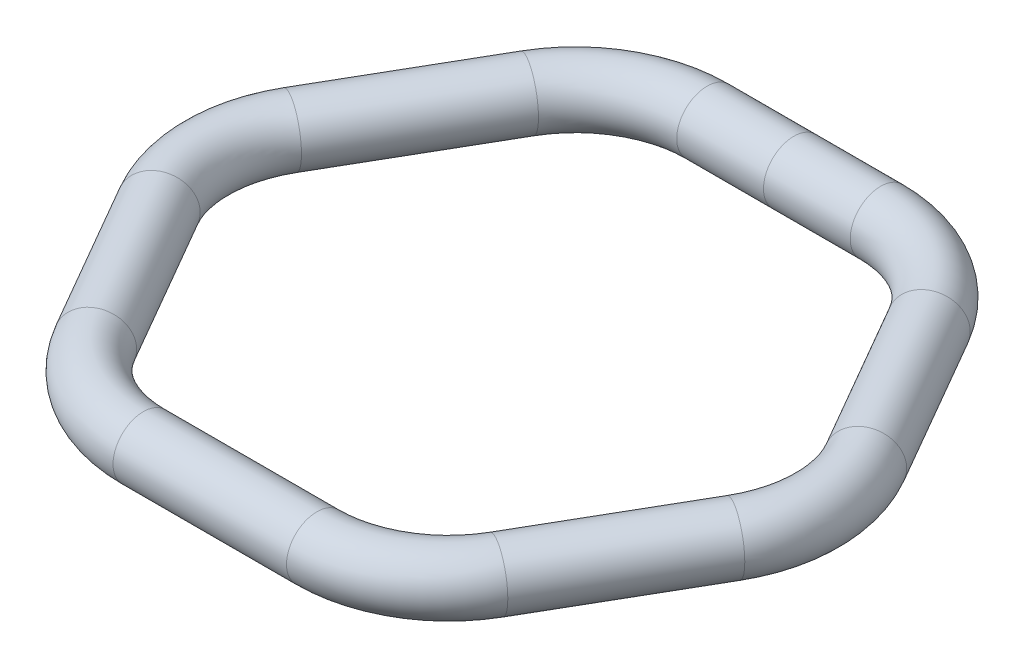
ISO-10303-21;
HEADER;
FILE_DESCRIPTION(('STEP AP214'),'2;1');
FILE_NAME('part.step','',(''),(''),'','','');
FILE_SCHEMA(('AUTOMOTIVE_DESIGN { 1 0 10303 214 1 1 1 1 }'));
ENDSEC;
DATA;
#1=APPLICATION_CONTEXT('core data for automotive mechanical design processes');
#2=APPLICATION_PROTOCOL_DEFINITION('international standard','automotive_design',2000,#1);
#3=PRODUCT_CONTEXT('',#1,'mechanical');
#4=PRODUCT('Part','Part','',(#3));
#5=PRODUCT_RELATED_PRODUCT_CATEGORY('part','',(#4));
#6=PRODUCT_DEFINITION_FORMATION('','',#4);
#7=PRODUCT_DEFINITION_CONTEXT('part definition',#1,'design');
#8=PRODUCT_DEFINITION('design','',#6,#7);
#9=PRODUCT_DEFINITION_SHAPE('','',#8);
#10=(LENGTH_UNIT() NAMED_UNIT(*) SI_UNIT(.MILLI.,.METRE.));
#11=(NAMED_UNIT(*) PLANE_ANGLE_UNIT() SI_UNIT($,.RADIAN.));
#12=(NAMED_UNIT(*) SI_UNIT($,.STERADIAN.) SOLID_ANGLE_UNIT());
#13=UNCERTAINTY_MEASURE_WITH_UNIT(LENGTH_MEASURE(1.E-05),#10,'distance_accuracy_value','');
#14=(GEOMETRIC_REPRESENTATION_CONTEXT(3) GLOBAL_UNCERTAINTY_ASSIGNED_CONTEXT((#13)) GLOBAL_UNIT_ASSIGNED_CONTEXT((#10,
#11,#12)) REPRESENTATION_CONTEXT('',''));
#15=CARTESIAN_POINT('',(0.,0.,0.));
#16=DIRECTION('',(0.,0.,1.));
#17=DIRECTION('',(1.,0.,0.));
#18=AXIS2_PLACEMENT_3D('',#15,#16,#17);
#19=CARTESIAN_POINT('',(-21.4196949869351,0.,-69.6));
#20=DIRECTION('',(1.,0.,0.));
#21=DIRECTION('',(0.,0.,-1.));
#22=AXIS2_PLACEMENT_3D('',#19,#20,#21);
#23=CYLINDRICAL_SURFACE('',#22,7.50000000000001);
#24=CARTESIAN_POINT('',(0.,0.,-69.6));
#25=DIRECTION('',(1.,0.,0.));
#26=DIRECTION('',(0.,0.,-1.));
#27=AXIS2_PLACEMENT_3D('',#24,#25,#26);
#28=CIRCLE('',#27,7.50000000000001);
#29=CARTESIAN_POINT('',(0.,0.,-77.1));
#30=VERTEX_POINT('',#29);
#31=EDGE_CURVE('E73',#30,#30,#28,.T.);
#32=ORIENTED_EDGE('',*,*,#31,.F.);
#33=EDGE_LOOP('',(#32));
#34=FACE_BOUND('',#33,.T.);
#35=CARTESIAN_POINT('',(-21.4196949869351,0.,-69.6));
#36=DIRECTION('',(1.,0.,0.));
#37=DIRECTION('',(0.,0.,-1.));
#38=AXIS2_PLACEMENT_3D('',#35,#36,#37);
#39=CIRCLE('',#38,7.50000000000001);
#40=CARTESIAN_POINT('',(-21.4196949869351,0.,-77.1));
#41=VERTEX_POINT('',#40);
#42=EDGE_CURVE('E10',#41,#41,#39,.T.);
#43=ORIENTED_EDGE('',*,*,#42,.T.);
#44=EDGE_LOOP('',(#43));
#45=FACE_BOUND('',#44,.T.);
#46=ADVANCED_FACE('F30',(#34,#45),#23,.T.);
#47=CARTESIAN_POINT('',(-21.4196949869351,0.,-37.1));
#48=DIRECTION('',(0.,-1.,0.));
#49=DIRECTION('',(0.,0.,-1.));
#50=AXIS2_PLACEMENT_3D('',#47,#48,#49);
#51=TOROIDAL_SURFACE('',#50,32.5,7.50000000000001);
#52=CARTESIAN_POINT('',(-49.5655206099294,0.,-53.35));
#53=DIRECTION('',(0.5,0.,-0.866025403784438));
#54=DIRECTION('',(-0.866025403784438,0.,-0.5));
#55=AXIS2_PLACEMENT_3D('',#52,#53,#54);
#56=CIRCLE('',#55,7.50000000000001);
#57=CARTESIAN_POINT('',(-56.0607111383127,0.,-57.1));
#58=VERTEX_POINT('',#57);
#59=EDGE_CURVE('E36',#58,#58,#56,.T.);
#60=CARTESIAN_POINT('',(-21.4196949869351,0.,-37.1));
#61=DIRECTION('',(0.,-1.,0.));
#62=DIRECTION('',(0.,0.,-1.));
#63=AXIS2_PLACEMENT_3D('',#60,#61,#62);
#64=CIRCLE('',#63,40.);
#65=EDGE_CURVE('',#58,#41,#64,.T.);
#66=ORIENTED_EDGE('',*,*,#59,.T.);
#67=ORIENTED_EDGE('',*,*,#42,.F.);
#68=ORIENTED_EDGE('',*,*,#65,.T.);
#69=ORIENTED_EDGE('',*,*,#65,.F.);
#70=EDGE_LOOP('',(#66,#68,#67,#69));
#71=FACE_BOUND('',#70,.T.);
#72=ADVANCED_FACE('F80',(#71),#51,.T.);
#73=CARTESIAN_POINT('',(-70.9852155968645,0.,-16.25));
#74=DIRECTION('',(0.5,0.,-0.866025403784439));
#75=DIRECTION('',(-0.866025403784439,0.,-0.5));
#76=AXIS2_PLACEMENT_3D('',#73,#74,#75);
#77=CYLINDRICAL_SURFACE('',#76,7.50000000000001);
#78=ORIENTED_EDGE('',*,*,#59,.F.);
#79=EDGE_LOOP('',(#78));
#80=FACE_BOUND('',#79,.T.);
#81=CARTESIAN_POINT('',(-70.9852155968645,0.,-16.25));
#82=DIRECTION('',(0.5,0.,-0.866025403784438));
#83=DIRECTION('',(-0.866025403784439,0.,-0.5));
#84=AXIS2_PLACEMENT_3D('',#81,#82,#83);
#85=CIRCLE('',#84,7.50000000000001);
#86=CARTESIAN_POINT('',(-77.4804061252478,0.,-20.));
#87=VERTEX_POINT('',#86);
#88=EDGE_CURVE('E40',#87,#87,#85,.T.);
#89=ORIENTED_EDGE('',*,*,#88,.T.);
#90=EDGE_LOOP('',(#89));
#91=FACE_BOUND('',#90,.T.);
#92=ADVANCED_FACE('F84',(#80,#91),#77,.T.);
#93=CARTESIAN_POINT('',(-42.8393899738703,0.,0.));
#94=DIRECTION('',(0.,-1.,0.));
#95=DIRECTION('',(0.,0.,-1.));
#96=AXIS2_PLACEMENT_3D('',#93,#94,#95);
#97=TOROIDAL_SURFACE('',#96,32.5,7.50000000000001);
#98=CARTESIAN_POINT('',(-70.9852155968645,0.,16.25));
#99=DIRECTION('',(-0.5,0.,-0.866025403784439));
#100=DIRECTION('',(-0.866025403784439,0.,0.5));
#101=AXIS2_PLACEMENT_3D('',#98,#99,#100);
#102=CIRCLE('',#101,7.50000000000001);
#103=CARTESIAN_POINT('',(-77.4804061252478,0.,20.));
#104=VERTEX_POINT('',#103);
#105=EDGE_CURVE('E44',#104,#104,#102,.T.);
#106=CARTESIAN_POINT('',(-42.8393899738703,0.,0.));
#107=DIRECTION('',(0.,-1.,0.));
#108=DIRECTION('',(0.,0.,-1.));
#109=AXIS2_PLACEMENT_3D('',#106,#107,#108);
#110=CIRCLE('',#109,40.);
#111=EDGE_CURVE('',#104,#87,#110,.T.);
#112=ORIENTED_EDGE('',*,*,#105,.T.);
#113=ORIENTED_EDGE('',*,*,#88,.F.);
#114=ORIENTED_EDGE('',*,*,#111,.T.);
#115=ORIENTED_EDGE('',*,*,#111,.F.);
#116=EDGE_LOOP('',(#112,#114,#113,#115));
#117=FACE_BOUND('',#116,.T.);
#118=ADVANCED_FACE('F89',(#117),#97,.T.);
#119=CARTESIAN_POINT('',(-49.5655206099294,0.,53.35));
#120=DIRECTION('',(-0.5,0.,-0.866025403784438));
#121=DIRECTION('',(-0.866025403784439,0.,0.5));
#122=AXIS2_PLACEMENT_3D('',#119,#120,#121);
#123=CYLINDRICAL_SURFACE('',#122,7.50000000000001);
#124=CARTESIAN_POINT('',(-49.5655206099294,0.,53.35));
#125=DIRECTION('',(-0.5,0.,-0.866025403784439));
#126=DIRECTION('',(-0.866025403784439,0.,0.5));
#127=AXIS2_PLACEMENT_3D('',#124,#125,#126);
#128=CIRCLE('',#127,7.50000000000001);
#129=CARTESIAN_POINT('',(-56.0607111383127,0.,57.1));
#130=VERTEX_POINT('',#129);
#131=EDGE_CURVE('E49',#130,#130,#128,.T.);
#132=CARTESIAN_POINT('',(-77.4804061252478,0.,20.));
#133=CARTESIAN_POINT('',(-77.2572843024672,0.,20.3864583333333));
#134=CARTESIAN_POINT('',(-77.0341624796867,0.,20.7729166666667));
#135=CARTESIAN_POINT('',(-76.5879188341255,0.,21.5458333333333));
#136=CARTESIAN_POINT('',(-76.3647970113449,0.,21.9322916666667));
#137=CARTESIAN_POINT('',(-75.9185533657838,0.,22.7052083333333));
#138=CARTESIAN_POINT('',(-75.6954315430032,0.,23.0916666666667));
#139=CARTESIAN_POINT('',(-75.2491878974421,0.,23.8645833333333));
#140=CARTESIAN_POINT('',(-75.0260660746615,0.,24.2510416666667));
#141=CARTESIAN_POINT('',(-74.5798224291004,0.,25.0239583333333));
#142=CARTESIAN_POINT('',(-74.3567006063198,0.,25.4104166666667));
#143=CARTESIAN_POINT('',(-73.9104569607586,0.,26.1833333333333));
#144=CARTESIAN_POINT('',(-73.6873351379781,0.,26.5697916666667));
#145=CARTESIAN_POINT('',(-73.2410914924169,0.,27.3427083333333));
#146=CARTESIAN_POINT('',(-73.0179696696363,0.,27.7291666666667));
#147=CARTESIAN_POINT('',(-72.5717260240752,0.,28.5020833333333));
#148=CARTESIAN_POINT('',(-72.3486042012946,0.,28.8885416666667));
#149=CARTESIAN_POINT('',(-71.9023605557335,0.,29.6614583333333));
#150=CARTESIAN_POINT('',(-71.6792387329529,0.,30.0479166666667));
#151=CARTESIAN_POINT('',(-71.2329950873917,0.,30.8208333333333));
#152=CARTESIAN_POINT('',(-71.0098732646112,0.,31.2072916666667));
#153=CARTESIAN_POINT('',(-70.56362961905,0.,31.9802083333333));
#154=CARTESIAN_POINT('',(-70.3405077962694,0.,32.3666666666667));
#155=CARTESIAN_POINT('',(-69.8942641507083,0.,33.1395833333333));
#156=CARTESIAN_POINT('',(-69.6711423279277,0.,33.5260416666667));
#157=CARTESIAN_POINT('',(-69.2248986823666,0.,34.2989583333333));
#158=CARTESIAN_POINT('',(-69.001776859586,0.,34.6854166666667));
#159=CARTESIAN_POINT('',(-68.5555332140248,0.,35.4583333333333));
#160=CARTESIAN_POINT('',(-68.3324113912443,0.,35.8447916666667));
#161=CARTESIAN_POINT('',(-67.8861677456831,0.,36.6177083333333));
#162=CARTESIAN_POINT('',(-67.6630459229026,0.,37.0041666666667));
#163=CARTESIAN_POINT('',(-67.2168022773414,0.,37.7770833333333));
#164=CARTESIAN_POINT('',(-66.9936804545608,0.,38.1635416666667));
#165=CARTESIAN_POINT('',(-66.5474368089997,0.,38.9364583333333));
#166=CARTESIAN_POINT('',(-66.3243149862191,0.,39.3229166666667));
#167=CARTESIAN_POINT('',(-65.878071340658,0.,40.0958333333333));
#168=CARTESIAN_POINT('',(-65.6549495178774,0.,40.4822916666667));
#169=CARTESIAN_POINT('',(-65.2087058723162,0.,41.2552083333333));
#170=CARTESIAN_POINT('',(-64.9855840495356,0.,41.6416666666667));
#171=CARTESIAN_POINT('',(-64.5393404039745,0.,42.4145833333333));
#172=CARTESIAN_POINT('',(-64.3162185811939,0.,42.8010416666667));
#173=CARTESIAN_POINT('',(-63.8699749356328,0.,43.5739583333333));
#174=CARTESIAN_POINT('',(-63.6468531128522,0.,43.9604166666667));
#175=CARTESIAN_POINT('',(-63.2006094672911,0.,44.7333333333333));
#176=CARTESIAN_POINT('',(-62.9774876445105,0.,45.1197916666667));
#177=CARTESIAN_POINT('',(-62.5312439989493,0.,45.8927083333333));
#178=CARTESIAN_POINT('',(-62.3081221761688,0.,46.2791666666667));
#179=CARTESIAN_POINT('',(-61.8618785306076,0.,47.0520833333333));
#180=CARTESIAN_POINT('',(-61.638756707827,0.,47.4385416666667));
#181=CARTESIAN_POINT('',(-61.1925130622659,0.,48.2114583333333));
#182=CARTESIAN_POINT('',(-60.9693912394853,0.,48.5979166666667));
#183=CARTESIAN_POINT('',(-60.5231475939242,0.,49.3708333333333));
#184=CARTESIAN_POINT('',(-60.3000257711436,0.,49.7572916666667));
#185=CARTESIAN_POINT('',(-59.8537821255825,0.,50.5302083333333));
#186=CARTESIAN_POINT('',(-59.6306603028019,0.,50.9166666666667));
#187=CARTESIAN_POINT('',(-59.1844166572407,0.,51.6895833333333));
#188=CARTESIAN_POINT('',(-58.9612948344601,0.,52.0760416666667));
#189=CARTESIAN_POINT('',(-58.515051188899,0.,52.8489583333333));
#190=CARTESIAN_POINT('',(-58.2919293661184,0.,53.2354166666667));
#191=CARTESIAN_POINT('',(-57.8456857205573,0.,54.0083333333333));
#192=CARTESIAN_POINT('',(-57.6225638977767,0.,54.3947916666667));
#193=CARTESIAN_POINT('',(-57.1763202522156,0.,55.1677083333333));
#194=CARTESIAN_POINT('',(-56.953198429435,0.,55.5541666666667));
#195=CARTESIAN_POINT('',(-56.5069547838738,0.,56.3270833333333));
#196=CARTESIAN_POINT('',(-56.2838329610933,0.,56.7135416666667));
#197=CARTESIAN_POINT('',(-56.0607111383127,0.,57.1));
#198=B_SPLINE_CURVE_WITH_KNOTS('',3,(#132,#133,#134,#135,#136,#137,#138,#139,#140,#141,#142,
#143,#144,#145,#146,#147,#148,#149,#150,#151,#152,#153,#154,#155,#156,#157,#158,#159,#160,#161,
#162,#163,#164,#165,#166,#167,#168,#169,#170,#171,#172,#173,#174,#175,#176,#177,#178,#179,#180,
#181,#182,#183,#184,#185,#186,#187,#188,#189,#190,#191,#192,#193,#194,#195,#196,#197),
.UNSPECIFIED.,.F.,.F.,(4,2,2,2,2,2,2,2,2,2,2,2,2,2,2,2,2,2,2,2,2,2,2,2,2,2,2,2,2,2,2,2,4),(0.,
1.33873093668344,2.67746187336689,4.01619281005033,5.35492374673377,6.69365468341722,
8.03238562010067,9.37111655678412,10.7098474934676,12.048578430151,13.3873093668344,
14.7260403035179,16.0647712402013,17.4035021768848,18.7422331135682,20.0809640502517,
21.4196949869351,22.7584259236186,24.097156860302,25.4358877969854,26.7746187336689,
28.1133496703523,29.4520806070358,30.7908115437192,32.1295424804027,33.4682734170861,
34.8070043537696,36.145735290453,37.4844662271365,38.8231971638199,40.1619281005033,
41.5006590371868,42.8393899738702),.UNSPECIFIED.);
#199=EDGE_CURVE('BSEAM95',#104,#130,#198,.T.);
#200=ORIENTED_EDGE('',*,*,#105,.F.);
#201=ORIENTED_EDGE('',*,*,#131,.T.);
#202=ORIENTED_EDGE('',*,*,#199,.T.);
#203=ORIENTED_EDGE('',*,*,#199,.F.);
#204=EDGE_LOOP('',(#200,#202,#201,#203));
#205=FACE_BOUND('',#204,.T.);
#206=ADVANCED_FACE('F95',(#205),#123,.T.);
#207=CARTESIAN_POINT('',(-21.4196949869351,0.,37.1));
#208=DIRECTION('',(0.,-1.,0.));
#209=DIRECTION('',(0.,0.,-1.));
#210=AXIS2_PLACEMENT_3D('',#207,#208,#209);
#211=TOROIDAL_SURFACE('',#210,32.5,7.50000000000001);
#212=CARTESIAN_POINT('',(-21.4196949869351,0.,69.6));
#213=DIRECTION('',(-1.,0.,0.));
#214=DIRECTION('',(0.,0.,1.));
#215=AXIS2_PLACEMENT_3D('',#212,#213,#214);
#216=CIRCLE('',#215,7.50000000000001);
#217=CARTESIAN_POINT('',(-21.4196949869351,0.,77.1));
#218=VERTEX_POINT('',#217);
#219=EDGE_CURVE('E52',#218,#218,#216,.T.);
#220=CARTESIAN_POINT('',(-21.4196949869351,0.,37.1));
#221=DIRECTION('',(0.,-1.,0.));
#222=DIRECTION('',(0.,0.,-1.));
#223=AXIS2_PLACEMENT_3D('',#220,#221,#222);
#224=CIRCLE('',#223,40.);
#225=EDGE_CURVE('',#218,#130,#224,.T.);
#226=ORIENTED_EDGE('',*,*,#219,.T.);
#227=ORIENTED_EDGE('',*,*,#131,.F.);
#228=ORIENTED_EDGE('',*,*,#225,.T.);
#229=ORIENTED_EDGE('',*,*,#225,.F.);
#230=EDGE_LOOP('',(#226,#228,#227,#229));
#231=FACE_BOUND('',#230,.T.);
#232=ADVANCED_FACE('F99',(#231),#211,.T.);
#233=CARTESIAN_POINT('',(21.4196949869351,0.,69.6));
#234=DIRECTION('',(-1.,0.,0.));
#235=DIRECTION('',(0.,0.,1.));
#236=AXIS2_PLACEMENT_3D('',#233,#234,#235);
#237=CYLINDRICAL_SURFACE('',#236,7.50000000000001);
#238=ORIENTED_EDGE('',*,*,#219,.F.);
#239=EDGE_LOOP('',(#238));
#240=FACE_BOUND('',#239,.T.);
#241=CARTESIAN_POINT('',(21.4196949869351,0.,69.6));
#242=DIRECTION('',(-1.,0.,0.));
#243=DIRECTION('',(0.,0.,1.));
#244=AXIS2_PLACEMENT_3D('',#241,#242,#243);
#245=CIRCLE('',#244,7.50000000000001);
#246=CARTESIAN_POINT('',(21.4196949869351,0.,77.1));
#247=VERTEX_POINT('',#246);
#248=EDGE_CURVE('E55',#247,#247,#245,.T.);
#249=ORIENTED_EDGE('',*,*,#248,.T.);
#250=EDGE_LOOP('',(#249));
#251=FACE_BOUND('',#250,.T.);
#252=ADVANCED_FACE('F103',(#240,#251),#237,.T.);
#253=CARTESIAN_POINT('',(21.4196949869351,0.,37.1));
#254=DIRECTION('',(0.,-1.,0.));
#255=DIRECTION('',(0.,0.,-1.));
#256=AXIS2_PLACEMENT_3D('',#253,#254,#255);
#257=TOROIDAL_SURFACE('',#256,32.5,7.50000000000001);
#258=CARTESIAN_POINT('',(49.5655206099294,0.,53.35));
#259=DIRECTION('',(-0.5,0.,0.866025403784439));
#260=DIRECTION('',(0.866025403784439,0.,0.5));
#261=AXIS2_PLACEMENT_3D('',#258,#259,#260);
#262=CIRCLE('',#261,7.50000000000001);
#263=CARTESIAN_POINT('',(56.0607111383127,0.,57.1));
#264=VERTEX_POINT('',#263);
#265=EDGE_CURVE('E58',#264,#264,#262,.T.);
#266=CARTESIAN_POINT('',(21.4196949869351,0.,37.1));
#267=DIRECTION('',(0.,-1.,0.));
#268=DIRECTION('',(0.,0.,-1.));
#269=AXIS2_PLACEMENT_3D('',#266,#267,#268);
#270=CIRCLE('',#269,40.);
#271=EDGE_CURVE('',#264,#247,#270,.T.);
#272=ORIENTED_EDGE('',*,*,#265,.T.);
#273=ORIENTED_EDGE('',*,*,#248,.F.);
#274=ORIENTED_EDGE('',*,*,#271,.T.);
#275=ORIENTED_EDGE('',*,*,#271,.F.);
#276=EDGE_LOOP('',(#272,#274,#273,#275));
#277=FACE_BOUND('',#276,.T.);
#278=ADVANCED_FACE('F107',(#277),#257,.T.);
#279=CARTESIAN_POINT('',(70.9852155968645,0.,16.25));
#280=DIRECTION('',(-0.5,0.,0.866025403784439));
#281=DIRECTION('',(0.866025403784439,0.,0.5));
#282=AXIS2_PLACEMENT_3D('',#279,#280,#281);
#283=CYLINDRICAL_SURFACE('',#282,7.50000000000001);
#284=ORIENTED_EDGE('',*,*,#265,.F.);
#285=EDGE_LOOP('',(#284));
#286=FACE_BOUND('',#285,.T.);
#287=CARTESIAN_POINT('',(70.9852155968645,0.,16.25));
#288=DIRECTION('',(-0.5,0.,0.866025403784439));
#289=DIRECTION('',(0.866025403784439,0.,0.5));
#290=AXIS2_PLACEMENT_3D('',#287,#288,#289);
#291=CIRCLE('',#290,7.50000000000001);
#292=CARTESIAN_POINT('',(77.4804061252478,0.,20.));
#293=VERTEX_POINT('',#292);
#294=EDGE_CURVE('E61',#293,#293,#291,.T.);
#295=ORIENTED_EDGE('',*,*,#294,.T.);
#296=EDGE_LOOP('',(#295));
#297=FACE_BOUND('',#296,.T.);
#298=ADVANCED_FACE('F111',(#286,#297),#283,.T.);
#299=CARTESIAN_POINT('',(42.8393899738702,0.,0.));
#300=DIRECTION('',(0.,-1.,0.));
#301=DIRECTION('',(0.,0.,-1.));
#302=AXIS2_PLACEMENT_3D('',#299,#300,#301);
#303=TOROIDAL_SURFACE('',#302,32.5,7.50000000000001);
#304=CARTESIAN_POINT('',(70.9852155968645,0.,-16.25));
#305=DIRECTION('',(0.5,0.,0.866025403784439));
#306=DIRECTION('',(0.866025403784439,0.,-0.5));
#307=AXIS2_PLACEMENT_3D('',#304,#305,#306);
#308=CIRCLE('',#307,7.50000000000001);
#309=CARTESIAN_POINT('',(77.4804061252478,0.,-20.));
#310=VERTEX_POINT('',#309);
#311=EDGE_CURVE('E64',#310,#310,#308,.T.);
#312=CARTESIAN_POINT('',(42.8393899738702,0.,0.));
#313=DIRECTION('',(0.,-1.,0.));
#314=DIRECTION('',(0.,0.,-1.));
#315=AXIS2_PLACEMENT_3D('',#312,#313,#314);
#316=CIRCLE('',#315,40.);
#317=EDGE_CURVE('',#310,#293,#316,.T.);
#318=ORIENTED_EDGE('',*,*,#311,.T.);
#319=ORIENTED_EDGE('',*,*,#294,.F.);
#320=ORIENTED_EDGE('',*,*,#317,.T.);
#321=ORIENTED_EDGE('',*,*,#317,.F.);
#322=EDGE_LOOP('',(#318,#320,#319,#321));
#323=FACE_BOUND('',#322,.T.);
#324=ADVANCED_FACE('F115',(#323),#303,.T.);
#325=CARTESIAN_POINT('',(49.5655206099293,0.,-53.35));
#326=DIRECTION('',(0.5,0.,0.866025403784438));
#327=DIRECTION('',(0.866025403784439,0.,-0.5));
#328=AXIS2_PLACEMENT_3D('',#325,#326,#327);
#329=CYLINDRICAL_SURFACE('',#328,7.50000000000001);
#330=CARTESIAN_POINT('',(49.5655206099293,0.,-53.35));
#331=DIRECTION('',(0.5,0.,0.866025403784438));
#332=DIRECTION('',(0.866025403784438,0.,-0.5));
#333=AXIS2_PLACEMENT_3D('',#330,#331,#332);
#334=CIRCLE('',#333,7.50000000000001);
#335=CARTESIAN_POINT('',(56.0607111383126,0.,-57.1));
#336=VERTEX_POINT('',#335);
#337=EDGE_CURVE('E67',#336,#336,#334,.T.);
#338=CARTESIAN_POINT('',(77.4804061252478,0.,-20.));
#339=CARTESIAN_POINT('',(77.2572843024672,0.,-20.3864583333334));
#340=CARTESIAN_POINT('',(77.0341624796866,0.,-20.7729166666667));
#341=CARTESIAN_POINT('',(76.5879188341255,0.,-21.5458333333334));
#342=CARTESIAN_POINT('',(76.3647970113449,0.,-21.9322916666667));
#343=CARTESIAN_POINT('',(75.9185533657837,0.,-22.7052083333334));
#344=CARTESIAN_POINT('',(75.6954315430032,0.,-23.0916666666667));
#345=CARTESIAN_POINT('',(75.249187897442,0.,-23.8645833333334));
#346=CARTESIAN_POINT('',(75.0260660746614,0.,-24.2510416666667));
#347=CARTESIAN_POINT('',(74.5798224291003,0.,-25.0239583333334));
#348=CARTESIAN_POINT('',(74.3567006063197,0.,-25.4104166666667));
#349=CARTESIAN_POINT('',(73.9104569607586,0.,-26.1833333333334));
#350=CARTESIAN_POINT('',(73.687335137978,0.,-26.5697916666667));
#351=CARTESIAN_POINT('',(73.2410914924169,0.,-27.3427083333334));
#352=CARTESIAN_POINT('',(73.0179696696363,0.,-27.7291666666667));
#353=CARTESIAN_POINT('',(72.5717260240751,0.,-28.5020833333334));
#354=CARTESIAN_POINT('',(72.3486042012945,0.,-28.8885416666667));
#355=CARTESIAN_POINT('',(71.9023605557334,0.,-29.6614583333334));
#356=CARTESIAN_POINT('',(71.6792387329528,0.,-30.0479166666667));
#357=CARTESIAN_POINT('',(71.2329950873917,0.,-30.8208333333334));
#358=CARTESIAN_POINT('',(71.0098732646111,0.,-31.2072916666667));
#359=CARTESIAN_POINT('',(70.5636296190499,0.,-31.9802083333334));
#360=CARTESIAN_POINT('',(70.3405077962694,0.,-32.3666666666667));
#361=CARTESIAN_POINT('',(69.8942641507082,0.,-33.1395833333334));
#362=CARTESIAN_POINT('',(69.6711423279277,0.,-33.5260416666667));
#363=CARTESIAN_POINT('',(69.2248986823665,0.,-34.2989583333334));
#364=CARTESIAN_POINT('',(69.0017768595859,0.,-34.6854166666667));
#365=CARTESIAN_POINT('',(68.5555332140248,0.,-35.4583333333334));
#366=CARTESIAN_POINT('',(68.3324113912442,0.,-35.8447916666667));
#367=CARTESIAN_POINT('',(67.8861677456831,0.,-36.6177083333334));
#368=CARTESIAN_POINT('',(67.6630459229025,0.,-37.0041666666667));
#369=CARTESIAN_POINT('',(67.2168022773413,0.,-37.7770833333334));
#370=CARTESIAN_POINT('',(66.9936804545608,0.,-38.1635416666667));
#371=CARTESIAN_POINT('',(66.5474368089996,0.,-38.9364583333334));
#372=CARTESIAN_POINT('',(66.3243149862191,0.,-39.3229166666667));
#373=CARTESIAN_POINT('',(65.8780713406579,0.,-40.0958333333334));
#374=CARTESIAN_POINT('',(65.6549495178773,0.,-40.4822916666667));
#375=CARTESIAN_POINT('',(65.2087058723162,0.,-41.2552083333334));
#376=CARTESIAN_POINT('',(64.9855840495356,0.,-41.6416666666667));
#377=CARTESIAN_POINT('',(64.5393404039744,0.,-42.4145833333334));
#378=CARTESIAN_POINT('',(64.3162185811939,0.,-42.8010416666667));
#379=CARTESIAN_POINT('',(63.8699749356327,0.,-43.5739583333334));
#380=CARTESIAN_POINT('',(63.6468531128521,0.,-43.9604166666667));
#381=CARTESIAN_POINT('',(63.200609467291,0.,-44.7333333333334));
#382=CARTESIAN_POINT('',(62.9774876445104,0.,-45.1197916666667));
#383=CARTESIAN_POINT('',(62.5312439989493,0.,-45.8927083333334));
#384=CARTESIAN_POINT('',(62.3081221761687,0.,-46.2791666666667));
#385=CARTESIAN_POINT('',(61.8618785306076,0.,-47.0520833333334));
#386=CARTESIAN_POINT('',(61.638756707827,0.,-47.4385416666667));
#387=CARTESIAN_POINT('',(61.1925130622658,0.,-48.2114583333334));
#388=CARTESIAN_POINT('',(60.9693912394853,0.,-48.5979166666667));
#389=CARTESIAN_POINT('',(60.5231475939241,0.,-49.3708333333334));
#390=CARTESIAN_POINT('',(60.3000257711435,0.,-49.7572916666667));
#391=CARTESIAN_POINT('',(59.8537821255824,0.,-50.5302083333334));
#392=CARTESIAN_POINT('',(59.6306603028018,0.,-50.9166666666667));
#393=CARTESIAN_POINT('',(59.1844166572407,0.,-51.6895833333334));
#394=CARTESIAN_POINT('',(58.9612948344601,0.,-52.0760416666667));
#395=CARTESIAN_POINT('',(58.515051188899,0.,-52.8489583333334));
#396=CARTESIAN_POINT('',(58.2919293661184,0.,-53.2354166666667));
#397=CARTESIAN_POINT('',(57.8456857205572,0.,-54.0083333333334));
#398=CARTESIAN_POINT('',(57.6225638977766,0.,-54.3947916666667));
#399=CARTESIAN_POINT('',(57.1763202522155,0.,-55.1677083333334));
#400=CARTESIAN_POINT('',(56.9531984294349,0.,-55.5541666666667));
#401=CARTESIAN_POINT('',(56.5069547838738,0.,-56.3270833333334));
#402=CARTESIAN_POINT('',(56.2838329610932,0.,-56.7135416666667));
#403=CARTESIAN_POINT('',(56.0607111383126,0.,-57.1));
#404=B_SPLINE_CURVE_WITH_KNOTS('',3,(#338,#339,#340,#341,#342,#343,#344,#345,#346,#347,#348,
#349,#350,#351,#352,#353,#354,#355,#356,#357,#358,#359,#360,#361,#362,#363,#364,#365,#366,#367,
#368,#369,#370,#371,#372,#373,#374,#375,#376,#377,#378,#379,#380,#381,#382,#383,#384,#385,#386,
#387,#388,#389,#390,#391,#392,#393,#394,#395,#396,#397,#398,#399,#400,#401,#402,#403),
.UNSPECIFIED.,.F.,.F.,(4,2,2,2,2,2,2,2,2,2,2,2,2,2,2,2,2,2,2,2,2,2,2,2,2,2,2,2,2,2,2,2,4),(0.,
1.33873093668345,2.67746187336689,4.01619281005033,5.35492374673379,6.69365468341722,
8.03238562010067,9.37111655678412,10.7098474934676,12.048578430151,13.3873093668345,
14.7260403035179,16.0647712402013,17.4035021768848,18.7422331135682,20.0809640502517,
21.4196949869351,22.7584259236186,24.097156860302,25.4358877969855,26.7746187336689,
28.1133496703523,29.4520806070358,30.7908115437192,32.1295424804027,33.4682734170861,
34.8070043537696,36.145735290453,37.4844662271365,38.8231971638199,40.1619281005034,
41.5006590371868,42.8393899738702),.UNSPECIFIED.);
#405=EDGE_CURVE('BSEAM119',#310,#336,#404,.T.);
#406=ORIENTED_EDGE('',*,*,#311,.F.);
#407=ORIENTED_EDGE('',*,*,#337,.T.);
#408=ORIENTED_EDGE('',*,*,#405,.T.);
#409=ORIENTED_EDGE('',*,*,#405,.F.);
#410=EDGE_LOOP('',(#406,#408,#407,#409));
#411=FACE_BOUND('',#410,.T.);
#412=ADVANCED_FACE('F119',(#411),#329,.T.);
#413=CARTESIAN_POINT('',(21.4196949869351,0.,-37.1));
#414=DIRECTION('',(0.,-1.,0.));
#415=DIRECTION('',(0.,0.,-1.));
#416=AXIS2_PLACEMENT_3D('',#413,#414,#415);
#417=TOROIDAL_SURFACE('',#416,32.5,7.50000000000001);
#418=CARTESIAN_POINT('',(21.4196949869351,0.,-69.6));
#419=DIRECTION('',(1.,0.,0.));
#420=DIRECTION('',(0.,0.,-1.));
#421=AXIS2_PLACEMENT_3D('',#418,#419,#420);
#422=CIRCLE('',#421,7.50000000000001);
#423=CARTESIAN_POINT('',(21.4196949869351,0.,-77.1));
#424=VERTEX_POINT('',#423);
#425=EDGE_CURVE('E70',#424,#424,#422,.T.);
#426=CARTESIAN_POINT('',(21.4196949869351,0.,-37.1));
#427=DIRECTION('',(0.,-1.,0.));
#428=DIRECTION('',(0.,0.,-1.));
#429=AXIS2_PLACEMENT_3D('',#426,#427,#428);
#430=CIRCLE('',#429,40.);
#431=EDGE_CURVE('',#424,#336,#430,.T.);
#432=ORIENTED_EDGE('',*,*,#425,.T.);
#433=ORIENTED_EDGE('',*,*,#337,.F.);
#434=ORIENTED_EDGE('',*,*,#431,.T.);
#435=ORIENTED_EDGE('',*,*,#431,.F.);
#436=EDGE_LOOP('',(#432,#434,#433,#435));
#437=FACE_BOUND('',#436,.T.);
#438=ADVANCED_FACE('F123',(#437),#417,.T.);
#439=CARTESIAN_POINT('',(0.,0.,-69.6));
#440=DIRECTION('',(1.,0.,0.));
#441=DIRECTION('',(0.,0.,-1.));
#442=AXIS2_PLACEMENT_3D('',#439,#440,#441);
#443=CYLINDRICAL_SURFACE('',#442,7.50000000000001);
#444=ORIENTED_EDGE('',*,*,#425,.F.);
#445=EDGE_LOOP('',(#444));
#446=FACE_BOUND('',#445,.T.);
#447=ORIENTED_EDGE('',*,*,#31,.T.);
#448=EDGE_LOOP('',(#447));
#449=FACE_BOUND('',#448,.T.);
#450=ADVANCED_FACE('F77',(#446,#449),#443,.T.);
#451=CLOSED_SHELL('',(#46,#72,#92,#118,#206,#232,#252,#278,#298,#324,#412,#438,#450));
#452=MANIFOLD_SOLID_BREP('B2',#451);
#453=ADVANCED_BREP_SHAPE_REPRESENTATION('',(#18,#452),#14);
#454=SHAPE_DEFINITION_REPRESENTATION(#9,#453);
ENDSEC;
END-ISO-10303-21;
